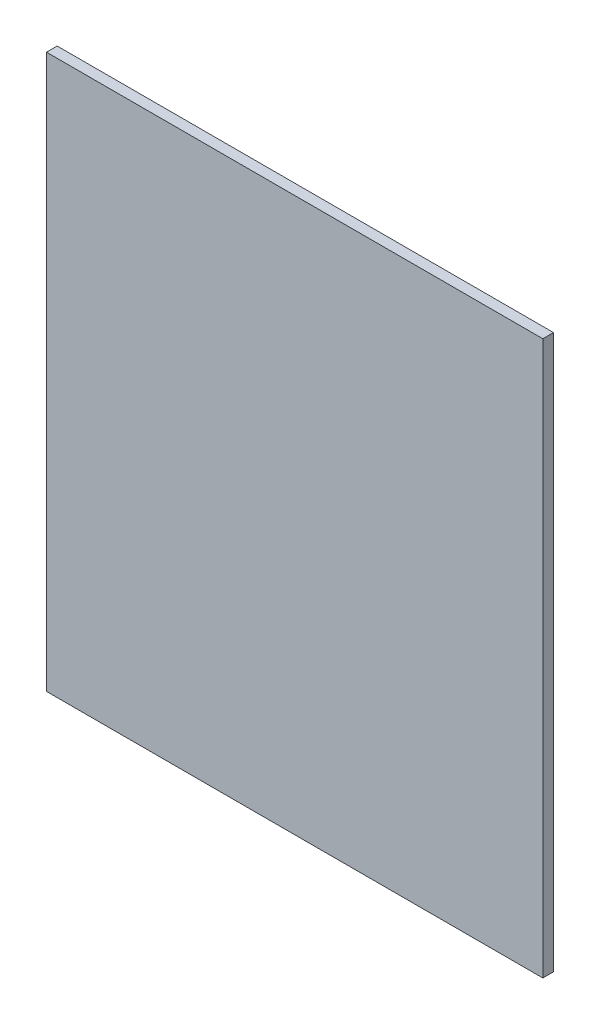
ISO-10303-21;
HEADER;
FILE_DESCRIPTION(('STEP AP214'),'2;1');
FILE_NAME('part.step','',(''),(''),'','','');
FILE_SCHEMA(('AUTOMOTIVE_DESIGN { 1 0 10303 214 1 1 1 1 }'));
ENDSEC;
DATA;
#1=APPLICATION_CONTEXT('core data for automotive mechanical design processes');
#2=APPLICATION_PROTOCOL_DEFINITION('international standard','automotive_design',2000,#1);
#3=PRODUCT_CONTEXT('',#1,'mechanical');
#4=PRODUCT('Part','Part','',(#3));
#5=PRODUCT_RELATED_PRODUCT_CATEGORY('part','',(#4));
#6=PRODUCT_DEFINITION_FORMATION('','',#4);
#7=PRODUCT_DEFINITION_CONTEXT('part definition',#1,'design');
#8=PRODUCT_DEFINITION('design','',#6,#7);
#9=PRODUCT_DEFINITION_SHAPE('','',#8);
#10=(LENGTH_UNIT() NAMED_UNIT(*) SI_UNIT(.MILLI.,.METRE.));
#11=(NAMED_UNIT(*) PLANE_ANGLE_UNIT() SI_UNIT($,.RADIAN.));
#12=(NAMED_UNIT(*) SI_UNIT($,.STERADIAN.) SOLID_ANGLE_UNIT());
#13=UNCERTAINTY_MEASURE_WITH_UNIT(LENGTH_MEASURE(1.E-05),#10,'distance_accuracy_value','');
#14=(GEOMETRIC_REPRESENTATION_CONTEXT(3) GLOBAL_UNCERTAINTY_ASSIGNED_CONTEXT((#13)) GLOBAL_UNIT_ASSIGNED_CONTEXT((#10,
#11,#12)) REPRESENTATION_CONTEXT('',''));
#15=CARTESIAN_POINT('',(0.,0.,0.));
#16=DIRECTION('',(0.,0.,1.));
#17=DIRECTION('',(1.,0.,0.));
#18=AXIS2_PLACEMENT_3D('',#15,#16,#17);
#19=CARTESIAN_POINT('',(0.,0.,0.7112));
#20=DIRECTION('',(0.,0.,1.));
#21=DIRECTION('',(1.,0.,0.));
#22=AXIS2_PLACEMENT_3D('',#19,#20,#21);
#23=PLANE('',#22);
#24=DIRECTION('',(0.,1.,0.));
#25=VECTOR('',#24,1.);
#26=CARTESIAN_POINT('',(-33.02,-36.83,0.7112));
#27=LINE('',#26,#25);
#28=CARTESIAN_POINT('',(-33.02,-36.83,0.7112));
#29=VERTEX_POINT('',#28);
#30=CARTESIAN_POINT('',(-33.02,36.83,0.7112));
#31=VERTEX_POINT('',#30);
#32=EDGE_CURVE('E68',#29,#31,#27,.T.);
#33=ORIENTED_EDGE('',*,*,#32,.F.);
#34=DIRECTION('',(1.,0.,0.));
#35=VECTOR('',#34,1.);
#36=CARTESIAN_POINT('',(33.02,-36.83,0.7112));
#37=LINE('',#36,#35);
#38=CARTESIAN_POINT('',(33.02,-36.83,0.7112));
#39=VERTEX_POINT('',#38);
#40=EDGE_CURVE('E20',#39,#29,#37,.F.);
#41=ORIENTED_EDGE('',*,*,#40,.F.);
#42=DIRECTION('',(0.,1.,0.));
#43=VECTOR('',#42,1.);
#44=CARTESIAN_POINT('',(33.02,36.83,0.7112));
#45=LINE('',#44,#43);
#46=CARTESIAN_POINT('',(33.02,36.83,0.7112));
#47=VERTEX_POINT('',#46);
#48=EDGE_CURVE('E58',#47,#39,#45,.F.);
#49=ORIENTED_EDGE('',*,*,#48,.F.);
#50=DIRECTION('',(1.,0.,0.));
#51=VECTOR('',#50,1.);
#52=CARTESIAN_POINT('',(-33.02,36.83,0.7112));
#53=LINE('',#52,#51);
#54=EDGE_CURVE('E53',#31,#47,#53,.T.);
#55=ORIENTED_EDGE('',*,*,#54,.F.);
#56=EDGE_LOOP('',(#33,#41,#49,#55));
#57=FACE_BOUND('',#56,.T.);
#58=ADVANCED_FACE('F17',(#57),#23,.T.);
#59=CARTESIAN_POINT('',(33.02,-36.83,0.));
#60=DIRECTION('',(0.,-1.,0.));
#61=DIRECTION('',(0.,0.,-1.));
#62=AXIS2_PLACEMENT_3D('',#59,#60,#61);
#63=PLANE('',#62);
#64=DIRECTION('',(1.,0.,0.));
#65=VECTOR('',#64,1.);
#66=CARTESIAN_POINT('',(0.,-36.83,-0.7112));
#67=LINE('',#66,#65);
#68=CARTESIAN_POINT('',(-33.02,-36.83,-0.7112));
#69=VERTEX_POINT('',#68);
#70=CARTESIAN_POINT('',(33.02,-36.83,-0.7112));
#71=VERTEX_POINT('',#70);
#72=EDGE_CURVE('E74',#69,#71,#67,.T.);
#73=ORIENTED_EDGE('',*,*,#72,.T.);
#74=DIRECTION('',(0.,0.,-1.));
#75=VECTOR('',#74,1.);
#76=CARTESIAN_POINT('',(33.02,-36.83,0.));
#77=LINE('',#76,#75);
#78=EDGE_CURVE('E63',#39,#71,#77,.T.);
#79=ORIENTED_EDGE('',*,*,#78,.F.);
#80=ORIENTED_EDGE('',*,*,#40,.T.);
#81=DIRECTION('',(0.,0.,1.));
#82=VECTOR('',#81,1.);
#83=CARTESIAN_POINT('',(-33.02,-36.83,0.));
#84=LINE('',#83,#82);
#85=EDGE_CURVE('E81',#69,#29,#84,.T.);
#86=ORIENTED_EDGE('',*,*,#85,.F.);
#87=EDGE_LOOP('',(#73,#79,#80,#86));
#88=FACE_BOUND('',#87,.T.);
#89=ADVANCED_FACE('F73',(#88),#63,.T.);
#90=CARTESIAN_POINT('',(33.02,36.83,0.));
#91=DIRECTION('',(1.,0.,0.));
#92=DIRECTION('',(0.,0.,-1.));
#93=AXIS2_PLACEMENT_3D('',#90,#91,#92);
#94=PLANE('',#93);
#95=DIRECTION('',(0.,1.,0.));
#96=VECTOR('',#95,1.);
#97=CARTESIAN_POINT('',(33.02,0.,-0.7112));
#98=LINE('',#97,#96);
#99=CARTESIAN_POINT('',(33.02,36.83,-0.7112));
#100=VERTEX_POINT('',#99);
#101=EDGE_CURVE('E84',#71,#100,#98,.T.);
#102=ORIENTED_EDGE('',*,*,#101,.T.);
#103=DIRECTION('',(0.,0.,1.));
#104=VECTOR('',#103,1.);
#105=CARTESIAN_POINT('',(33.02,36.83,0.));
#106=LINE('',#105,#104);
#107=EDGE_CURVE('E65',#47,#100,#106,.F.);
#108=ORIENTED_EDGE('',*,*,#107,.F.);
#109=ORIENTED_EDGE('',*,*,#48,.T.);
#110=ORIENTED_EDGE('',*,*,#78,.T.);
#111=EDGE_LOOP('',(#102,#108,#109,#110));
#112=FACE_BOUND('',#111,.T.);
#113=ADVANCED_FACE('F61',(#112),#94,.T.);
#114=CARTESIAN_POINT('',(-33.02,36.83,0.));
#115=DIRECTION('',(0.,1.,0.));
#116=DIRECTION('',(0.,0.,1.));
#117=AXIS2_PLACEMENT_3D('',#114,#115,#116);
#118=PLANE('',#117);
#119=DIRECTION('',(1.,0.,0.));
#120=VECTOR('',#119,1.);
#121=CARTESIAN_POINT('',(0.,36.83,-0.7112));
#122=LINE('',#121,#120);
#123=CARTESIAN_POINT('',(-33.02,36.83,-0.7112));
#124=VERTEX_POINT('',#123);
#125=EDGE_CURVE('E26',#100,#124,#122,.F.);
#126=ORIENTED_EDGE('',*,*,#125,.T.);
#127=DIRECTION('',(0.,0.,1.));
#128=VECTOR('',#127,1.);
#129=CARTESIAN_POINT('',(-33.02,36.83,0.));
#130=LINE('',#129,#128);
#131=EDGE_CURVE('E34',#31,#124,#130,.F.);
#132=ORIENTED_EDGE('',*,*,#131,.F.);
#133=ORIENTED_EDGE('',*,*,#54,.T.);
#134=ORIENTED_EDGE('',*,*,#107,.T.);
#135=EDGE_LOOP('',(#126,#132,#133,#134));
#136=FACE_BOUND('',#135,.T.);
#137=ADVANCED_FACE('F88',(#136),#118,.T.);
#138=CARTESIAN_POINT('',(-33.02,-36.83,0.));
#139=DIRECTION('',(-1.,0.,0.));
#140=DIRECTION('',(0.,0.,1.));
#141=AXIS2_PLACEMENT_3D('',#138,#139,#140);
#142=PLANE('',#141);
#143=DIRECTION('',(0.,1.,0.));
#144=VECTOR('',#143,1.);
#145=CARTESIAN_POINT('',(-33.02,0.,-0.7112));
#146=LINE('',#145,#144);
#147=EDGE_CURVE('E11',#124,#69,#146,.F.);
#148=ORIENTED_EDGE('',*,*,#147,.T.);
#149=ORIENTED_EDGE('',*,*,#85,.T.);
#150=ORIENTED_EDGE('',*,*,#32,.T.);
#151=ORIENTED_EDGE('',*,*,#131,.T.);
#152=EDGE_LOOP('',(#148,#149,#150,#151));
#153=FACE_BOUND('',#152,.T.);
#154=ADVANCED_FACE('F91',(#153),#142,.T.);
#155=CARTESIAN_POINT('',(0.,0.,-0.7112));
#156=DIRECTION('',(0.,0.,1.));
#157=DIRECTION('',(1.,0.,0.));
#158=AXIS2_PLACEMENT_3D('',#155,#156,#157);
#159=PLANE('',#158);
#160=ORIENTED_EDGE('',*,*,#125,.F.);
#161=ORIENTED_EDGE('',*,*,#101,.F.);
#162=ORIENTED_EDGE('',*,*,#72,.F.);
#163=ORIENTED_EDGE('',*,*,#147,.F.);
#164=EDGE_LOOP('',(#160,#161,#162,#163));
#165=FACE_BOUND('',#164,.T.);
#166=ADVANCED_FACE('F90',(#165),#159,.F.);
#167=CLOSED_SHELL('',(#58,#89,#113,#137,#154,#166));
#168=MANIFOLD_SOLID_BREP('B1',#167);
#169=ADVANCED_BREP_SHAPE_REPRESENTATION('',(#18,#168),#14);
#170=SHAPE_DEFINITION_REPRESENTATION(#9,#169);
ENDSEC;
END-ISO-10303-21;
